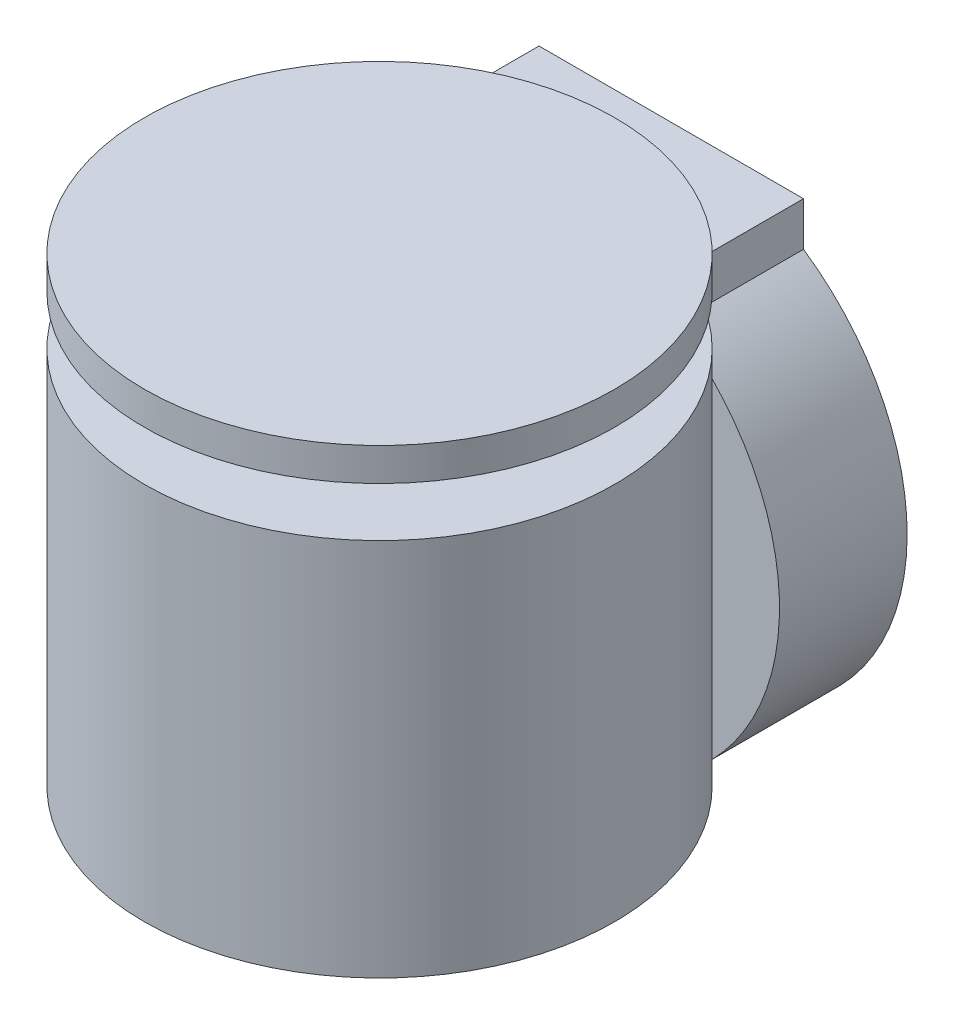
ISO-10303-21;
HEADER;
FILE_DESCRIPTION(('STEP AP214'),'2;1');
FILE_NAME('part.step','',(''),(''),'','','');
FILE_SCHEMA(('AUTOMOTIVE_DESIGN { 1 0 10303 214 1 1 1 1 }'));
ENDSEC;
DATA;
#1=APPLICATION_CONTEXT('core data for automotive mechanical design processes');
#2=APPLICATION_PROTOCOL_DEFINITION('international standard','automotive_design',2000,#1);
#3=PRODUCT_CONTEXT('',#1,'mechanical');
#4=PRODUCT('Part','Part','',(#3));
#5=PRODUCT_RELATED_PRODUCT_CATEGORY('part','',(#4));
#6=PRODUCT_DEFINITION_FORMATION('','',#4);
#7=PRODUCT_DEFINITION_CONTEXT('part definition',#1,'design');
#8=PRODUCT_DEFINITION('design','',#6,#7);
#9=PRODUCT_DEFINITION_SHAPE('','',#8);
#10=(LENGTH_UNIT() NAMED_UNIT(*) SI_UNIT(.MILLI.,.METRE.));
#11=(NAMED_UNIT(*) PLANE_ANGLE_UNIT() SI_UNIT($,.RADIAN.));
#12=(NAMED_UNIT(*) SI_UNIT($,.STERADIAN.) SOLID_ANGLE_UNIT());
#13=UNCERTAINTY_MEASURE_WITH_UNIT(LENGTH_MEASURE(1.E-05),#10,'distance_accuracy_value','');
#14=(GEOMETRIC_REPRESENTATION_CONTEXT(3) GLOBAL_UNCERTAINTY_ASSIGNED_CONTEXT((#13)) GLOBAL_UNIT_ASSIGNED_CONTEXT((#10,
#11,#12)) REPRESENTATION_CONTEXT('',''));
#15=CARTESIAN_POINT('',(0.,0.,0.));
#16=DIRECTION('',(0.,0.,1.));
#17=DIRECTION('',(1.,0.,0.));
#18=AXIS2_PLACEMENT_3D('',#15,#16,#17);
#19=CARTESIAN_POINT('',(0.,-0.023,0.));
#20=DIRECTION('',(0.,1.,0.));
#21=DIRECTION('',(0.,0.,1.));
#22=AXIS2_PLACEMENT_3D('',#19,#20,#21);
#23=CYLINDRICAL_SURFACE('',#22,0.0285615189790077);
#24=CARTESIAN_POINT('',(0.,0.,0.));
#25=DIRECTION('',(0.,0.707106781186547,0.707106781186547));
#26=DIRECTION('',(0.,0.707106781186547,-0.707106781186547));
#27=AXIS2_PLACEMENT_3D('',#24,#25,#26);
#28=ELLIPSE('',#27,0.0403954799070302,0.028563917771546);
#29=CARTESIAN_POINT('',(0.0169420908402558,0.023,-0.0229940410617346));
#30=VERTEX_POINT('',#29);
#31=CARTESIAN_POINT('',(0.0203902027059128,0.0200068507179732,-0.02));
#32=VERTEX_POINT('',#31);
#33=EDGE_CURVE('E184',#30,#32,#28,.F.);
#34=ORIENTED_EDGE('',*,*,#33,.F.);
#35=CARTESIAN_POINT('',(0.,0.023,0.));
#36=DIRECTION('',(0.,1.,0.));
#37=DIRECTION('',(0.,0.,1.));
#38=AXIS2_PLACEMENT_3D('',#35,#36,#37);
#39=CIRCLE('',#38,0.0285615189790077);
#40=CARTESIAN_POINT('',(-0.0169420908402558,0.023,-0.0229940410617346));
#41=VERTEX_POINT('',#40);
#42=EDGE_CURVE('E194',#41,#30,#39,.T.);
#43=ORIENTED_EDGE('',*,*,#42,.F.);
#44=CARTESIAN_POINT('',(-0.0203902027059128,0.0200068507179732,-0.02));
#45=VERTEX_POINT('',#44);
#46=EDGE_CURVE('E187',#45,#41,#28,.F.);
#47=ORIENTED_EDGE('',*,*,#46,.F.);
#48=DIRECTION('',(0.,1.,0.));
#49=VECTOR('',#48,1.);
#50=CARTESIAN_POINT('',(-0.0203902027059128,-0.023,-0.02));
#51=LINE('',#50,#49);
#52=CARTESIAN_POINT('',(-0.0203902027059128,-0.0200068507179732,-0.02));
#53=VERTEX_POINT('',#52);
#54=EDGE_CURVE('E179',#53,#45,#51,.T.);
#55=ORIENTED_EDGE('',*,*,#54,.F.);
#56=CARTESIAN_POINT('',(0.,0.,0.));
#57=DIRECTION('',(0.,0.707106781186547,-0.707106781186547));
#58=DIRECTION('',(0.,0.707106781186547,0.707106781186547));
#59=AXIS2_PLACEMENT_3D('',#56,#57,#58);
#60=ELLIPSE('',#59,0.0403954799070302,0.028563917771546);
#61=CARTESIAN_POINT('',(-0.0169420908402558,-0.023,-0.0229940410617346));
#62=VERTEX_POINT('',#61);
#63=EDGE_CURVE('E192',#62,#53,#60,.T.);
#64=ORIENTED_EDGE('',*,*,#63,.F.);
#65=CARTESIAN_POINT('',(0.,-0.023,0.));
#66=DIRECTION('',(0.,1.,0.));
#67=DIRECTION('',(0.,0.,1.));
#68=AXIS2_PLACEMENT_3D('',#65,#66,#67);
#69=CIRCLE('',#68,0.0285615189790077);
#70=CARTESIAN_POINT('',(0.0169420908402558,-0.023,-0.0229940410617346));
#71=VERTEX_POINT('',#70);
#72=EDGE_CURVE('E197',#62,#71,#69,.T.);
#73=ORIENTED_EDGE('',*,*,#72,.T.);
#74=CARTESIAN_POINT('',(0.0203902027059128,-0.0200068507179732,-0.02));
#75=VERTEX_POINT('',#74);
#76=EDGE_CURVE('E61',#75,#71,#60,.T.);
#77=ORIENTED_EDGE('',*,*,#76,.F.);
#78=DIRECTION('',(0.,1.,0.));
#79=VECTOR('',#78,1.);
#80=CARTESIAN_POINT('',(0.0203902027059128,-0.023,-0.02));
#81=LINE('',#80,#79);
#82=EDGE_CURVE('E182',#32,#75,#81,.F.);
#83=ORIENTED_EDGE('',*,*,#82,.F.);
#84=EDGE_LOOP('',(#34,#43,#47,#55,#64,#73,#77,#83));
#85=FACE_BOUND('',#84,.T.);
#86=ADVANCED_FACE('F39',(#85),#23,.T.);
#87=CARTESIAN_POINT('',(0.,-0.023,0.));
#88=DIRECTION('',(0.,1.,0.));
#89=DIRECTION('',(0.,0.,1.));
#90=AXIS2_PLACEMENT_3D('',#87,#88,#89);
#91=PLANE('',#90);
#92=ORIENTED_EDGE('',*,*,#72,.F.);
#93=DIRECTION('',(0.,0.,1.));
#94=VECTOR('',#93,1.);
#95=CARTESIAN_POINT('',(-0.0169420908402558,-0.023,-0.0355));
#96=LINE('',#95,#94);
#97=CARTESIAN_POINT('',(-0.0169420908402558,-0.023,-0.02));
#98=VERTEX_POINT('',#97);
#99=EDGE_CURVE('E191',#62,#98,#96,.T.);
#100=ORIENTED_EDGE('',*,*,#99,.T.);
#101=DIRECTION('',(1.,0.,0.));
#102=VECTOR('',#101,1.);
#103=CARTESIAN_POINT('',(0.,-0.023,-0.02));
#104=LINE('',#103,#102);
#105=CARTESIAN_POINT('',(0.0169420908402558,-0.023,-0.02));
#106=VERTEX_POINT('',#105);
#107=EDGE_CURVE('E173',#98,#106,#104,.T.);
#108=ORIENTED_EDGE('',*,*,#107,.T.);
#109=DIRECTION('',(0.,0.,1.));
#110=VECTOR('',#109,1.);
#111=CARTESIAN_POINT('',(0.0169420908402558,-0.023,-0.0355));
#112=LINE('',#111,#110);
#113=EDGE_CURVE('E188',#106,#71,#112,.F.);
#114=ORIENTED_EDGE('',*,*,#113,.T.);
#115=EDGE_LOOP('',(#92,#100,#108,#114));
#116=FACE_BOUND('',#115,.T.);
#117=ADVANCED_FACE('F232',(#116),#91,.F.);
#118=CARTESIAN_POINT('',(0.,0.023,0.));
#119=DIRECTION('',(0.,1.,0.));
#120=DIRECTION('',(0.,0.,1.));
#121=AXIS2_PLACEMENT_3D('',#118,#119,#120);
#122=PLANE('',#121);
#123=DIRECTION('',(0.,0.,1.));
#124=VECTOR('',#123,1.);
#125=CARTESIAN_POINT('',(-0.0169420908402558,0.023,-0.0355));
#126=LINE('',#125,#124);
#127=CARTESIAN_POINT('',(-0.0169420908402558,0.023,-0.02));
#128=VERTEX_POINT('',#127);
#129=EDGE_CURVE('E11',#41,#128,#126,.T.);
#130=ORIENTED_EDGE('',*,*,#129,.F.);
#131=ORIENTED_EDGE('',*,*,#42,.T.);
#132=DIRECTION('',(0.,0.,1.));
#133=VECTOR('',#132,1.);
#134=CARTESIAN_POINT('',(0.0169420908402558,0.023,-0.0355));
#135=LINE('',#134,#133);
#136=CARTESIAN_POINT('',(0.0169420908402558,0.023,-0.02));
#137=VERTEX_POINT('',#136);
#138=EDGE_CURVE('E46',#137,#30,#135,.F.);
#139=ORIENTED_EDGE('',*,*,#138,.F.);
#140=DIRECTION('',(1.,0.,0.));
#141=VECTOR('',#140,1.);
#142=CARTESIAN_POINT('',(0.,0.023,-0.02));
#143=LINE('',#142,#141);
#144=EDGE_CURVE('E199',#128,#137,#143,.T.);
#145=ORIENTED_EDGE('',*,*,#144,.F.);
#146=EDGE_LOOP('',(#130,#131,#139,#145));
#147=FACE_BOUND('',#146,.T.);
#148=ADVANCED_FACE('F209',(#147),#122,.T.);
#149=CARTESIAN_POINT('',(0.,0.,-0.02));
#150=DIRECTION('',(0.,0.,1.));
#151=DIRECTION('',(1.,0.,0.));
#152=AXIS2_PLACEMENT_3D('',#149,#150,#151);
#153=PLANE('',#152);
#154=CARTESIAN_POINT('',(0.,0.,-0.02));
#155=DIRECTION('',(0.,0.,1.));
#156=DIRECTION('',(1.,0.,0.));
#157=AXIS2_PLACEMENT_3D('',#154,#155,#156);
#158=CIRCLE('',#157,0.0285663165640843);
#159=EDGE_CURVE('E219',#75,#32,#158,.T.);
#160=ORIENTED_EDGE('',*,*,#159,.T.);
#161=ORIENTED_EDGE('',*,*,#82,.T.);
#162=EDGE_LOOP('',(#160,#161));
#163=FACE_BOUND('',#162,.T.);
#164=ADVANCED_FACE('F218',(#163),#153,.T.);
#165=ORIENTED_EDGE('',*,*,#107,.F.);
#166=EDGE_CURVE('E221',#98,#106,#158,.T.);
#167=ORIENTED_EDGE('',*,*,#166,.T.);
#168=EDGE_LOOP('',(#165,#167));
#169=FACE_BOUND('',#168,.T.);
#170=ADVANCED_FACE('F233',(#169),#153,.T.);
#171=EDGE_CURVE('E167',#45,#53,#158,.T.);
#172=ORIENTED_EDGE('',*,*,#171,.T.);
#173=ORIENTED_EDGE('',*,*,#54,.T.);
#174=EDGE_LOOP('',(#172,#173));
#175=FACE_BOUND('',#174,.T.);
#176=ADVANCED_FACE('F228',(#175),#153,.T.);
#177=CARTESIAN_POINT('',(0.,0.,-0.0355));
#178=DIRECTION('',(0.,0.,1.));
#179=DIRECTION('',(1.,0.,0.));
#180=AXIS2_PLACEMENT_3D('',#177,#178,#179);
#181=CYLINDRICAL_SURFACE('',#180,0.0285663165640843);
#182=ORIENTED_EDGE('',*,*,#99,.F.);
#183=ORIENTED_EDGE('',*,*,#63,.T.);
#184=ORIENTED_EDGE('',*,*,#171,.F.);
#185=ORIENTED_EDGE('',*,*,#46,.T.);
#186=ORIENTED_EDGE('',*,*,#129,.T.);
#187=CARTESIAN_POINT('',(-0.0161310924099964,0.0235758838582912,-0.02));
#188=VERTEX_POINT('',#187);
#189=EDGE_CURVE('E163',#188,#128,#158,.T.);
#190=ORIENTED_EDGE('',*,*,#189,.F.);
#191=DIRECTION('',(0.,0.,1.));
#192=VECTOR('',#191,1.);
#193=CARTESIAN_POINT('',(-0.0161310924099964,0.0235758838582912,-0.0355));
#194=LINE('',#193,#192);
#195=CARTESIAN_POINT('',(-0.0161310924099964,0.0235758838582912,-0.0355));
#196=VERTEX_POINT('',#195);
#197=EDGE_CURVE('E128',#196,#188,#194,.T.);
#198=ORIENTED_EDGE('',*,*,#197,.F.);
#199=CARTESIAN_POINT('',(0.,0.,-0.0355));
#200=DIRECTION('',(0.,0.,1.));
#201=DIRECTION('',(1.,0.,0.));
#202=AXIS2_PLACEMENT_3D('',#199,#200,#201);
#203=CIRCLE('',#202,0.0285663165640843);
#204=CARTESIAN_POINT('',(0.0159824536772525,0.0236769004832549,-0.0355));
#205=VERTEX_POINT('',#204);
#206=EDGE_CURVE('E153',#196,#205,#203,.T.);
#207=ORIENTED_EDGE('',*,*,#206,.T.);
#208=DIRECTION('',(0.,0.,1.));
#209=VECTOR('',#208,1.);
#210=CARTESIAN_POINT('',(0.0159824536772525,0.0236769004832549,-0.0355));
#211=LINE('',#210,#209);
#212=CARTESIAN_POINT('',(0.0159824536772525,0.0236769004832549,-0.02));
#213=VERTEX_POINT('',#212);
#214=EDGE_CURVE('E162',#205,#213,#211,.T.);
#215=ORIENTED_EDGE('',*,*,#214,.T.);
#216=EDGE_CURVE('E150',#137,#213,#158,.T.);
#217=ORIENTED_EDGE('',*,*,#216,.F.);
#218=ORIENTED_EDGE('',*,*,#138,.T.);
#219=ORIENTED_EDGE('',*,*,#33,.T.);
#220=ORIENTED_EDGE('',*,*,#159,.F.);
#221=ORIENTED_EDGE('',*,*,#76,.T.);
#222=ORIENTED_EDGE('',*,*,#113,.F.);
#223=ORIENTED_EDGE('',*,*,#166,.F.);
#224=EDGE_LOOP('',(#182,#183,#184,#185,#186,#190,#198,#207,#215,#217,#218,#219,#220,#221,#222,#223));
#225=FACE_BOUND('',#224,.T.);
#226=ADVANCED_FACE('F205',(#225),#181,.T.);
#227=CARTESIAN_POINT('',(-0.0161310924099964,0.0235758838582912,-0.0355));
#228=DIRECTION('',(-1.,0.,0.));
#229=DIRECTION('',(0.,0.,1.));
#230=AXIS2_PLACEMENT_3D('',#227,#228,#229);
#231=PLANE('',#230);
#232=DIRECTION('',(0.,-1.,0.));
#233=VECTOR('',#232,1.);
#234=CARTESIAN_POINT('',(-0.0161310924099964,0.0235758838582912,-0.02));
#235=LINE('',#234,#233);
#236=CARTESIAN_POINT('',(-0.0161310924099964,0.029,-0.02));
#237=VERTEX_POINT('',#236);
#238=EDGE_CURVE('E136',#237,#188,#235,.T.);
#239=ORIENTED_EDGE('',*,*,#238,.F.);
#240=DIRECTION('',(0.,0.,1.));
#241=VECTOR('',#240,1.);
#242=CARTESIAN_POINT('',(-0.0161310924099964,0.029,-0.0355));
#243=LINE('',#242,#241);
#244=CARTESIAN_POINT('',(-0.0161310924099964,0.029,-0.0235700705142851));
#245=VERTEX_POINT('',#244);
#246=EDGE_CURVE('E129',#245,#237,#243,.T.);
#247=ORIENTED_EDGE('',*,*,#246,.F.);
#248=CARTESIAN_POINT('',(-0.0161310924099964,0.029,-0.0355));
#249=VERTEX_POINT('',#248);
#250=EDGE_CURVE('E120',#249,#245,#243,.T.);
#251=ORIENTED_EDGE('',*,*,#250,.F.);
#252=DIRECTION('',(0.,-1.,0.));
#253=VECTOR('',#252,1.);
#254=CARTESIAN_POINT('',(-0.0161310924099964,0.0235758838582912,-0.0355));
#255=LINE('',#254,#253);
#256=EDGE_CURVE('E160',#249,#196,#255,.T.);
#257=ORIENTED_EDGE('',*,*,#256,.T.);
#258=ORIENTED_EDGE('',*,*,#197,.T.);
#259=EDGE_LOOP('',(#239,#247,#251,#257,#258));
#260=FACE_BOUND('',#259,.T.);
#261=ADVANCED_FACE('F134',(#260),#231,.T.);
#262=CARTESIAN_POINT('',(0.0159824536772525,0.029,-0.0355));
#263=DIRECTION('',(0.,1.,0.));
#264=DIRECTION('',(0.,0.,1.));
#265=AXIS2_PLACEMENT_3D('',#262,#263,#264);
#266=PLANE('',#265);
#267=CARTESIAN_POINT('',(0.,0.029,0.));
#268=DIRECTION('',(0.,1.,0.));
#269=DIRECTION('',(0.,0.,1.));
#270=AXIS2_PLACEMENT_3D('',#267,#268,#269);
#271=CIRCLE('',#270,0.0285615189790077);
#272=CARTESIAN_POINT('',(0.0159824536772525,0.029,-0.0236711119477454));
#273=VERTEX_POINT('',#272);
#274=EDGE_CURVE('E53',#273,#245,#271,.T.);
#275=ORIENTED_EDGE('',*,*,#274,.F.);
#276=DIRECTION('',(0.,0.,1.));
#277=VECTOR('',#276,1.);
#278=CARTESIAN_POINT('',(0.0159824536772525,0.029,-0.0355));
#279=LINE('',#278,#277);
#280=CARTESIAN_POINT('',(0.0159824536772525,0.029,-0.0355));
#281=VERTEX_POINT('',#280);
#282=EDGE_CURVE('E139',#281,#273,#279,.T.);
#283=ORIENTED_EDGE('',*,*,#282,.F.);
#284=DIRECTION('',(-1.,0.,0.));
#285=VECTOR('',#284,1.);
#286=CARTESIAN_POINT('',(0.0159824536772525,0.029,-0.0355));
#287=LINE('',#286,#285);
#288=EDGE_CURVE('E124',#281,#249,#287,.T.);
#289=ORIENTED_EDGE('',*,*,#288,.T.);
#290=ORIENTED_EDGE('',*,*,#250,.T.);
#291=EDGE_LOOP('',(#275,#283,#289,#290));
#292=FACE_BOUND('',#291,.T.);
#293=ADVANCED_FACE('F122',(#292),#266,.T.);
#294=CARTESIAN_POINT('',(0.0159824536772525,0.029,-0.0355));
#295=DIRECTION('',(1.,0.,0.));
#296=DIRECTION('',(0.,0.,-1.));
#297=AXIS2_PLACEMENT_3D('',#294,#295,#296);
#298=PLANE('',#297);
#299=DIRECTION('',(0.,1.,0.));
#300=VECTOR('',#299,1.);
#301=CARTESIAN_POINT('',(0.0159824536772525,0.029,-0.02));
#302=LINE('',#301,#300);
#303=CARTESIAN_POINT('',(0.0159824536772525,0.029,-0.02));
#304=VERTEX_POINT('',#303);
#305=EDGE_CURVE('E166',#213,#304,#302,.T.);
#306=ORIENTED_EDGE('',*,*,#305,.F.);
#307=ORIENTED_EDGE('',*,*,#214,.F.);
#308=DIRECTION('',(0.,1.,0.));
#309=VECTOR('',#308,1.);
#310=CARTESIAN_POINT('',(0.0159824536772525,0.029,-0.0355));
#311=LINE('',#310,#309);
#312=EDGE_CURVE('E156',#205,#281,#311,.T.);
#313=ORIENTED_EDGE('',*,*,#312,.T.);
#314=ORIENTED_EDGE('',*,*,#282,.T.);
#315=EDGE_CURVE('E144',#273,#304,#279,.T.);
#316=ORIENTED_EDGE('',*,*,#315,.T.);
#317=EDGE_LOOP('',(#306,#307,#313,#314,#316));
#318=FACE_BOUND('',#317,.T.);
#319=ADVANCED_FACE('F253',(#318),#298,.T.);
#320=CARTESIAN_POINT('',(0.,0.,-0.0355));
#321=DIRECTION('',(0.,0.,1.));
#322=DIRECTION('',(1.,0.,0.));
#323=AXIS2_PLACEMENT_3D('',#320,#321,#322);
#324=PLANE('',#323);
#325=ORIENTED_EDGE('',*,*,#206,.F.);
#326=ORIENTED_EDGE('',*,*,#256,.F.);
#327=ORIENTED_EDGE('',*,*,#288,.F.);
#328=ORIENTED_EDGE('',*,*,#312,.F.);
#329=EDGE_LOOP('',(#325,#326,#327,#328));
#330=FACE_BOUND('',#329,.T.);
#331=ADVANCED_FACE('F256',(#330),#324,.F.);
#332=ORIENTED_EDGE('',*,*,#189,.T.);
#333=ORIENTED_EDGE('',*,*,#144,.T.);
#334=ORIENTED_EDGE('',*,*,#216,.T.);
#335=ORIENTED_EDGE('',*,*,#305,.T.);
#336=DIRECTION('',(-1.,0.,0.));
#337=VECTOR('',#336,1.);
#338=CARTESIAN_POINT('',(0.0159824536772525,0.029,-0.02));
#339=LINE('',#338,#337);
#340=EDGE_CURVE('E170',#304,#237,#339,.T.);
#341=ORIENTED_EDGE('',*,*,#340,.T.);
#342=ORIENTED_EDGE('',*,*,#238,.T.);
#343=EDGE_LOOP('',(#332,#333,#334,#335,#341,#342));
#344=FACE_BOUND('',#343,.T.);
#345=ADVANCED_FACE('F212',(#344),#153,.T.);
#346=CARTESIAN_POINT('',(0.,0.033,0.));
#347=DIRECTION('',(0.,-1.,0.));
#348=DIRECTION('',(0.,0.,-1.));
#349=AXIS2_PLACEMENT_3D('',#346,#347,#348);
#350=CYLINDRICAL_SURFACE('',#349,0.0285615189790077);
#351=CARTESIAN_POINT('',(0.,0.033,0.));
#352=DIRECTION('',(0.,1.,0.));
#353=DIRECTION('',(0.,0.,1.));
#354=AXIS2_PLACEMENT_3D('',#351,#352,#353);
#355=CIRCLE('',#354,0.0285615189790077);
#356=CARTESIAN_POINT('',(0.,0.033,0.0285615189790077));
#357=VERTEX_POINT('',#356);
#358=EDGE_CURVE('E148',#357,#357,#355,.T.);
#359=ORIENTED_EDGE('',*,*,#358,.F.);
#360=EDGE_LOOP('',(#359));
#361=FACE_BOUND('',#360,.T.);
#362=ORIENTED_EDGE('',*,*,#274,.T.);
#363=EDGE_CURVE('E142',#245,#273,#271,.T.);
#364=ORIENTED_EDGE('',*,*,#363,.T.);
#365=EDGE_LOOP('',(#362,#364));
#366=FACE_BOUND('',#365,.T.);
#367=ADVANCED_FACE('F147',(#361,#366),#350,.T.);
#368=CARTESIAN_POINT('',(0.,0.033,0.));
#369=DIRECTION('',(0.,1.,0.));
#370=DIRECTION('',(0.,0.,1.));
#371=AXIS2_PLACEMENT_3D('',#368,#369,#370);
#372=PLANE('',#371);
#373=ORIENTED_EDGE('',*,*,#358,.T.);
#374=EDGE_LOOP('',(#373));
#375=FACE_BOUND('',#374,.T.);
#376=ADVANCED_FACE('F294',(#375),#372,.T.);
#377=CARTESIAN_POINT('',(0.,0.029,0.));
#378=DIRECTION('',(0.,1.,0.));
#379=DIRECTION('',(0.,0.,1.));
#380=AXIS2_PLACEMENT_3D('',#377,#378,#379);
#381=PLANE('',#380);
#382=ORIENTED_EDGE('',*,*,#315,.F.);
#383=ORIENTED_EDGE('',*,*,#363,.F.);
#384=ORIENTED_EDGE('',*,*,#246,.T.);
#385=ORIENTED_EDGE('',*,*,#340,.F.);
#386=EDGE_LOOP('',(#382,#383,#384,#385));
#387=FACE_BOUND('',#386,.T.);
#388=ADVANCED_FACE('F143',(#387),#381,.F.);
#389=CLOSED_SHELL('',(#86,#117,#148,#164,#170,#176,#226,#261,#293,#319,#331,#345,#367,#376,#388));
#390=MANIFOLD_SOLID_BREP('B2',#389);
#391=ADVANCED_BREP_SHAPE_REPRESENTATION('',(#18,#390),#14);
#392=SHAPE_DEFINITION_REPRESENTATION(#9,#391);
ENDSEC;
END-ISO-10303-21;
